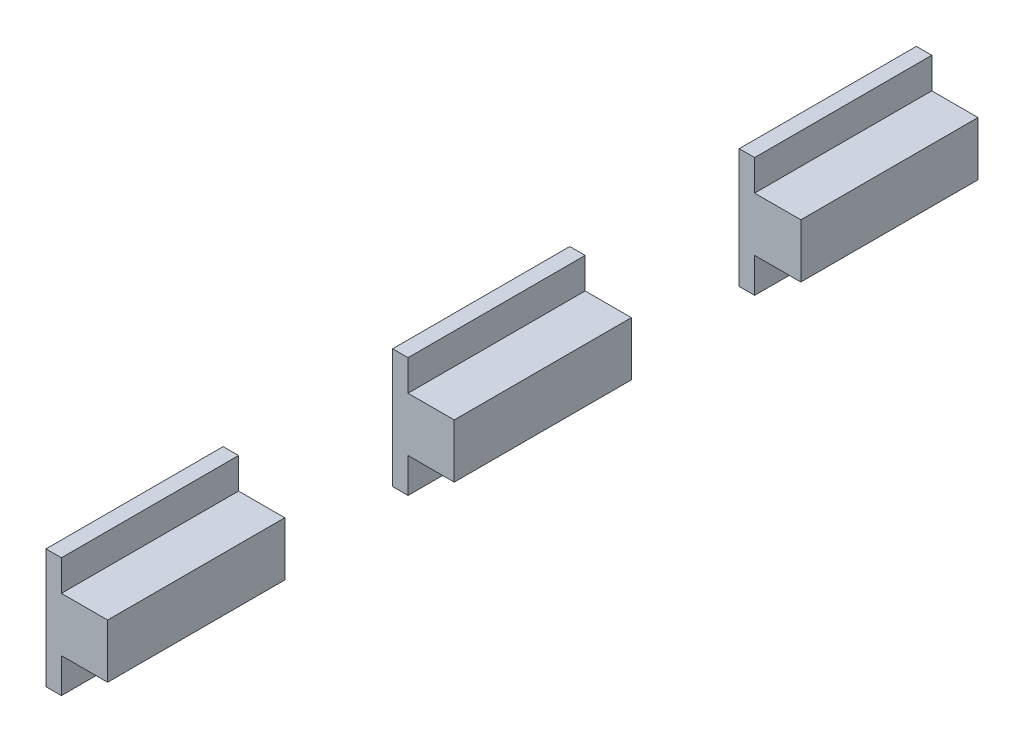
ISO-10303-21;
HEADER;
FILE_DESCRIPTION(('STEP AP214'),'2;1');
FILE_NAME('part.step','',(''),(''),'','','');
FILE_SCHEMA(('AUTOMOTIVE_DESIGN { 1 0 10303 214 1 1 1 1 }'));
ENDSEC;
DATA;
#1=APPLICATION_CONTEXT('core data for automotive mechanical design processes');
#2=APPLICATION_PROTOCOL_DEFINITION('international standard','automotive_design',2000,#1);
#3=PRODUCT_CONTEXT('',#1,'mechanical');
#4=PRODUCT('Part','Part','',(#3));
#5=PRODUCT_RELATED_PRODUCT_CATEGORY('part','',(#4));
#6=PRODUCT_DEFINITION_FORMATION('','',#4);
#7=PRODUCT_DEFINITION_CONTEXT('part definition',#1,'design');
#8=PRODUCT_DEFINITION('design','',#6,#7);
#9=PRODUCT_DEFINITION_SHAPE('','',#8);
#10=(LENGTH_UNIT() NAMED_UNIT(*) SI_UNIT(.MILLI.,.METRE.));
#11=(NAMED_UNIT(*) PLANE_ANGLE_UNIT() SI_UNIT($,.RADIAN.));
#12=(NAMED_UNIT(*) SI_UNIT($,.STERADIAN.) SOLID_ANGLE_UNIT());
#13=UNCERTAINTY_MEASURE_WITH_UNIT(LENGTH_MEASURE(1.E-05),#10,'distance_accuracy_value','');
#14=(GEOMETRIC_REPRESENTATION_CONTEXT(3) GLOBAL_UNCERTAINTY_ASSIGNED_CONTEXT((#13)) GLOBAL_UNIT_ASSIGNED_CONTEXT((#10,
#11,#12)) REPRESENTATION_CONTEXT('',''));
#15=CARTESIAN_POINT('',(0.,0.,0.));
#16=DIRECTION('',(0.,0.,1.));
#17=DIRECTION('',(1.,0.,0.));
#18=AXIS2_PLACEMENT_3D('',#15,#16,#17);
#19=CARTESIAN_POINT('',(87.8,0.,-18.));
#20=DIRECTION('',(1.,0.,0.));
#21=DIRECTION('',(0.,0.,-1.));
#22=AXIS2_PLACEMENT_3D('',#19,#20,#21);
#23=PLANE('',#22);
#24=DIRECTION('',(0.,0.,-1.));
#25=VECTOR('',#24,1.);
#26=CARTESIAN_POINT('',(87.8,12.45,-50.59));
#27=LINE('',#26,#25);
#28=CARTESIAN_POINT('',(87.8,12.45,-50.59));
#29=VERTEX_POINT('',#28);
#30=CARTESIAN_POINT('',(87.8,12.45,-55.19));
#31=VERTEX_POINT('',#30);
#32=EDGE_CURVE('E64',#29,#31,#27,.T.);
#33=ORIENTED_EDGE('',*,*,#32,.F.);
#34=DIRECTION('',(0.,-1.,0.));
#35=VECTOR('',#34,1.);
#36=CARTESIAN_POINT('',(87.8,14.65,-50.59));
#37=LINE('',#36,#35);
#38=CARTESIAN_POINT('',(87.8,11.55,-50.59));
#39=VERTEX_POINT('',#38);
#40=EDGE_CURVE('E159',#29,#39,#37,.T.);
#41=ORIENTED_EDGE('',*,*,#40,.T.);
#42=DIRECTION('',(0.,0.,-1.));
#43=VECTOR('',#42,1.);
#44=CARTESIAN_POINT('',(87.8,11.55,-50.59));
#45=LINE('',#44,#43);
#46=CARTESIAN_POINT('',(87.8,11.55,-55.19));
#47=VERTEX_POINT('',#46);
#48=EDGE_CURVE('E147',#39,#47,#45,.T.);
#49=ORIENTED_EDGE('',*,*,#48,.T.);
#50=DIRECTION('',(0.,1.,0.));
#51=VECTOR('',#50,1.);
#52=CARTESIAN_POINT('',(87.8,11.55,-55.19));
#53=LINE('',#52,#51);
#54=EDGE_CURVE('E137',#47,#31,#53,.T.);
#55=ORIENTED_EDGE('',*,*,#54,.T.);
#56=EDGE_LOOP('',(#33,#41,#49,#55));
#57=FACE_BOUND('',#56,.T.);
#58=ADVANCED_FACE('F47',(#57),#23,.T.);
#59=CARTESIAN_POINT('',(87.4,11.55,-55.19));
#60=DIRECTION('',(0.,0.,-1.));
#61=DIRECTION('',(-1.,0.,0.));
#62=AXIS2_PLACEMENT_3D('',#59,#60,#61);
#63=PLANE('',#62);
#64=ORIENTED_EDGE('',*,*,#54,.F.);
#65=DIRECTION('',(1.,0.,0.));
#66=VECTOR('',#65,1.);
#67=CARTESIAN_POINT('',(87.4,11.55,-55.19));
#68=LINE('',#67,#66);
#69=CARTESIAN_POINT('',(87.4,11.55,-55.19));
#70=VERTEX_POINT('',#69);
#71=EDGE_CURVE('E12',#70,#47,#68,.T.);
#72=ORIENTED_EDGE('',*,*,#71,.F.);
#73=DIRECTION('',(0.,1.,0.));
#74=VECTOR('',#73,1.);
#75=CARTESIAN_POINT('',(87.4,11.55,-55.19));
#76=LINE('',#75,#74);
#77=CARTESIAN_POINT('',(87.4,14.65,-55.19));
#78=VERTEX_POINT('',#77);
#79=EDGE_CURVE('E143',#70,#78,#76,.T.);
#80=ORIENTED_EDGE('',*,*,#79,.T.);
#81=DIRECTION('',(1.,0.,0.));
#82=VECTOR('',#81,1.);
#83=CARTESIAN_POINT('',(87.4,14.65,-55.19));
#84=LINE('',#83,#82);
#85=CARTESIAN_POINT('',(87.8,14.65,-55.19));
#86=VERTEX_POINT('',#85);
#87=EDGE_CURVE('E51',#78,#86,#84,.T.);
#88=ORIENTED_EDGE('',*,*,#87,.T.);
#89=CARTESIAN_POINT('',(87.8,13.85,-55.19));
#90=VERTEX_POINT('',#89);
#91=EDGE_CURVE('E135',#90,#86,#53,.T.);
#92=ORIENTED_EDGE('',*,*,#91,.F.);
#93=DIRECTION('',(-1.,0.,0.));
#94=VECTOR('',#93,1.);
#95=CARTESIAN_POINT('',(89.,13.85,-55.19));
#96=LINE('',#95,#94);
#97=CARTESIAN_POINT('',(89.,13.85,-55.19));
#98=VERTEX_POINT('',#97);
#99=EDGE_CURVE('E117',#98,#90,#96,.T.);
#100=ORIENTED_EDGE('',*,*,#99,.F.);
#101=DIRECTION('',(0.,1.,0.));
#102=VECTOR('',#101,1.);
#103=CARTESIAN_POINT('',(89.,12.45,-55.19));
#104=LINE('',#103,#102);
#105=CARTESIAN_POINT('',(89.,12.45,-55.19));
#106=VERTEX_POINT('',#105);
#107=EDGE_CURVE('E123',#106,#98,#104,.T.);
#108=ORIENTED_EDGE('',*,*,#107,.F.);
#109=DIRECTION('',(-1.,0.,0.));
#110=VECTOR('',#109,1.);
#111=CARTESIAN_POINT('',(89.,12.45,-55.19));
#112=LINE('',#111,#110);
#113=EDGE_CURVE('E179',#106,#31,#112,.T.);
#114=ORIENTED_EDGE('',*,*,#113,.T.);
#115=EDGE_LOOP('',(#64,#72,#80,#88,#92,#100,#108,#114));
#116=FACE_BOUND('',#115,.T.);
#117=ADVANCED_FACE('F49',(#116),#63,.T.);
#118=CARTESIAN_POINT('',(87.4,11.55,-50.59));
#119=DIRECTION('',(0.,-1.,0.));
#120=DIRECTION('',(0.,0.,-1.));
#121=AXIS2_PLACEMENT_3D('',#118,#119,#120);
#122=PLANE('',#121);
#123=ORIENTED_EDGE('',*,*,#48,.F.);
#124=DIRECTION('',(1.,0.,0.));
#125=VECTOR('',#124,1.);
#126=CARTESIAN_POINT('',(87.4,11.55,-50.59));
#127=LINE('',#126,#125);
#128=CARTESIAN_POINT('',(87.4,11.55,-50.59));
#129=VERTEX_POINT('',#128);
#130=EDGE_CURVE('E56',#129,#39,#127,.T.);
#131=ORIENTED_EDGE('',*,*,#130,.F.);
#132=DIRECTION('',(0.,0.,-1.));
#133=VECTOR('',#132,1.);
#134=CARTESIAN_POINT('',(87.4,11.55,-50.59));
#135=LINE('',#134,#133);
#136=EDGE_CURVE('E153',#129,#70,#135,.T.);
#137=ORIENTED_EDGE('',*,*,#136,.T.);
#138=ORIENTED_EDGE('',*,*,#71,.T.);
#139=EDGE_LOOP('',(#123,#131,#137,#138));
#140=FACE_BOUND('',#139,.T.);
#141=ADVANCED_FACE('F187',(#140),#122,.T.);
#142=CARTESIAN_POINT('',(87.4,14.65,-50.59));
#143=DIRECTION('',(0.,0.,1.));
#144=DIRECTION('',(1.,0.,0.));
#145=AXIS2_PLACEMENT_3D('',#142,#143,#144);
#146=PLANE('',#145);
#147=CARTESIAN_POINT('',(87.8,14.65,-50.59));
#148=VERTEX_POINT('',#147);
#149=CARTESIAN_POINT('',(87.8,13.85,-50.59));
#150=VERTEX_POINT('',#149);
#151=EDGE_CURVE('E160',#148,#150,#37,.T.);
#152=ORIENTED_EDGE('',*,*,#151,.F.);
#153=DIRECTION('',(1.,0.,0.));
#154=VECTOR('',#153,1.);
#155=CARTESIAN_POINT('',(87.4,14.65,-50.59));
#156=LINE('',#155,#154);
#157=CARTESIAN_POINT('',(87.4,14.65,-50.59));
#158=VERTEX_POINT('',#157);
#159=EDGE_CURVE('E165',#158,#148,#156,.T.);
#160=ORIENTED_EDGE('',*,*,#159,.F.);
#161=DIRECTION('',(0.,-1.,0.));
#162=VECTOR('',#161,1.);
#163=CARTESIAN_POINT('',(87.4,14.65,-50.59));
#164=LINE('',#163,#162);
#165=EDGE_CURVE('E150',#158,#129,#164,.T.);
#166=ORIENTED_EDGE('',*,*,#165,.T.);
#167=ORIENTED_EDGE('',*,*,#130,.T.);
#168=ORIENTED_EDGE('',*,*,#40,.F.);
#169=DIRECTION('',(-1.,0.,0.));
#170=VECTOR('',#169,1.);
#171=CARTESIAN_POINT('',(89.,12.45,-50.59));
#172=LINE('',#171,#170);
#173=CARTESIAN_POINT('',(89.,12.45,-50.59));
#174=VERTEX_POINT('',#173);
#175=EDGE_CURVE('E139',#174,#29,#172,.T.);
#176=ORIENTED_EDGE('',*,*,#175,.F.);
#177=DIRECTION('',(0.,-1.,0.));
#178=VECTOR('',#177,1.);
#179=CARTESIAN_POINT('',(89.,13.85,-50.59));
#180=LINE('',#179,#178);
#181=CARTESIAN_POINT('',(89.,13.85,-50.59));
#182=VERTEX_POINT('',#181);
#183=EDGE_CURVE('E122',#182,#174,#180,.T.);
#184=ORIENTED_EDGE('',*,*,#183,.F.);
#185=DIRECTION('',(-1.,0.,0.));
#186=VECTOR('',#185,1.);
#187=CARTESIAN_POINT('',(89.,13.85,-50.59));
#188=LINE('',#187,#186);
#189=EDGE_CURVE('E119',#182,#150,#188,.T.);
#190=ORIENTED_EDGE('',*,*,#189,.T.);
#191=EDGE_LOOP('',(#152,#160,#166,#167,#168,#176,#184,#190));
#192=FACE_BOUND('',#191,.T.);
#193=ADVANCED_FACE('F175',(#192),#146,.T.);
#194=CARTESIAN_POINT('',(87.4,14.65,-55.19));
#195=DIRECTION('',(0.,1.,0.));
#196=DIRECTION('',(0.,0.,1.));
#197=AXIS2_PLACEMENT_3D('',#194,#195,#196);
#198=PLANE('',#197);
#199=DIRECTION('',(0.,0.,1.));
#200=VECTOR('',#199,1.);
#201=CARTESIAN_POINT('',(87.8,14.65,-55.19));
#202=LINE('',#201,#200);
#203=EDGE_CURVE('E156',#86,#148,#202,.T.);
#204=ORIENTED_EDGE('',*,*,#203,.F.);
#205=ORIENTED_EDGE('',*,*,#87,.F.);
#206=DIRECTION('',(0.,0.,1.));
#207=VECTOR('',#206,1.);
#208=CARTESIAN_POINT('',(87.4,14.65,-55.19));
#209=LINE('',#208,#207);
#210=EDGE_CURVE('E146',#78,#158,#209,.T.);
#211=ORIENTED_EDGE('',*,*,#210,.T.);
#212=ORIENTED_EDGE('',*,*,#159,.T.);
#213=EDGE_LOOP('',(#204,#205,#211,#212));
#214=FACE_BOUND('',#213,.T.);
#215=ADVANCED_FACE('F171',(#214),#198,.T.);
#216=CARTESIAN_POINT('',(87.4,0.,-18.));
#217=DIRECTION('',(1.,0.,0.));
#218=DIRECTION('',(0.,0.,-1.));
#219=AXIS2_PLACEMENT_3D('',#216,#217,#218);
#220=PLANE('',#219);
#221=ORIENTED_EDGE('',*,*,#79,.F.);
#222=ORIENTED_EDGE('',*,*,#136,.F.);
#223=ORIENTED_EDGE('',*,*,#165,.F.);
#224=ORIENTED_EDGE('',*,*,#210,.F.);
#225=EDGE_LOOP('',(#221,#222,#223,#224));
#226=FACE_BOUND('',#225,.T.);
#227=ADVANCED_FACE('F191',(#226),#220,.F.);
#228=DIRECTION('',(0.,0.,1.));
#229=VECTOR('',#228,1.);
#230=CARTESIAN_POINT('',(87.8,13.85,-55.19));
#231=LINE('',#230,#229);
#232=EDGE_CURVE('E72',#90,#150,#231,.T.);
#233=ORIENTED_EDGE('',*,*,#232,.F.);
#234=ORIENTED_EDGE('',*,*,#91,.T.);
#235=ORIENTED_EDGE('',*,*,#203,.T.);
#236=ORIENTED_EDGE('',*,*,#151,.T.);
#237=EDGE_LOOP('',(#233,#234,#235,#236));
#238=FACE_BOUND('',#237,.T.);
#239=ADVANCED_FACE('F172',(#238),#23,.T.);
#240=CARTESIAN_POINT('',(89.,13.85,-55.19));
#241=DIRECTION('',(0.,-1.,0.));
#242=DIRECTION('',(0.,0.,-1.));
#243=AXIS2_PLACEMENT_3D('',#240,#241,#242);
#244=PLANE('',#243);
#245=ORIENTED_EDGE('',*,*,#232,.T.);
#246=ORIENTED_EDGE('',*,*,#189,.F.);
#247=DIRECTION('',(0.,0.,1.));
#248=VECTOR('',#247,1.);
#249=CARTESIAN_POINT('',(89.,13.85,-55.19));
#250=LINE('',#249,#248);
#251=EDGE_CURVE('E113',#98,#182,#250,.T.);
#252=ORIENTED_EDGE('',*,*,#251,.F.);
#253=ORIENTED_EDGE('',*,*,#99,.T.);
#254=EDGE_LOOP('',(#245,#246,#252,#253));
#255=FACE_BOUND('',#254,.T.);
#256=ADVANCED_FACE('F115',(#255),#244,.F.);
#257=CARTESIAN_POINT('',(89.,12.45,-50.59));
#258=DIRECTION('',(0.,1.,0.));
#259=DIRECTION('',(0.,0.,1.));
#260=AXIS2_PLACEMENT_3D('',#257,#258,#259);
#261=PLANE('',#260);
#262=ORIENTED_EDGE('',*,*,#32,.T.);
#263=ORIENTED_EDGE('',*,*,#113,.F.);
#264=DIRECTION('',(0.,0.,-1.));
#265=VECTOR('',#264,1.);
#266=CARTESIAN_POINT('',(89.,12.45,-50.59));
#267=LINE('',#266,#265);
#268=EDGE_CURVE('E128',#174,#106,#267,.T.);
#269=ORIENTED_EDGE('',*,*,#268,.F.);
#270=ORIENTED_EDGE('',*,*,#175,.T.);
#271=EDGE_LOOP('',(#262,#263,#269,#270));
#272=FACE_BOUND('',#271,.T.);
#273=ADVANCED_FACE('F184',(#272),#261,.F.);
#274=CARTESIAN_POINT('',(89.,0.,-18.));
#275=DIRECTION('',(1.,0.,0.));
#276=DIRECTION('',(0.,0.,-1.));
#277=AXIS2_PLACEMENT_3D('',#274,#275,#276);
#278=PLANE('',#277);
#279=ORIENTED_EDGE('',*,*,#107,.T.);
#280=ORIENTED_EDGE('',*,*,#251,.T.);
#281=ORIENTED_EDGE('',*,*,#183,.T.);
#282=ORIENTED_EDGE('',*,*,#268,.T.);
#283=EDGE_LOOP('',(#279,#280,#281,#282));
#284=FACE_BOUND('',#283,.T.);
#285=ADVANCED_FACE('F126',(#284),#278,.T.);
#286=CLOSED_SHELL('',(#58,#117,#141,#193,#215,#227,#239,#256,#273,#285));
#287=MANIFOLD_SOLID_BREP('B2',#286);
#288=CARTESIAN_POINT('',(87.8,0.,-9.));
#289=DIRECTION('',(1.,0.,0.));
#290=DIRECTION('',(0.,0.,-1.));
#291=AXIS2_PLACEMENT_3D('',#288,#289,#290);
#292=PLANE('',#291);
#293=DIRECTION('',(0.,0.,-1.));
#294=VECTOR('',#293,1.);
#295=CARTESIAN_POINT('',(87.8,12.45,-41.59));
#296=LINE('',#295,#294);
#297=CARTESIAN_POINT('',(87.8,12.45,-41.59));
#298=VERTEX_POINT('',#297);
#299=CARTESIAN_POINT('',(87.8,12.45,-46.19));
#300=VERTEX_POINT('',#299);
#301=EDGE_CURVE('E304',#298,#300,#296,.T.);
#302=ORIENTED_EDGE('',*,*,#301,.F.);
#303=DIRECTION('',(0.,-1.,0.));
#304=VECTOR('',#303,1.);
#305=CARTESIAN_POINT('',(87.8,14.65,-41.59));
#306=LINE('',#305,#304);
#307=CARTESIAN_POINT('',(87.8,11.55,-41.59));
#308=VERTEX_POINT('',#307);
#309=EDGE_CURVE('E399',#298,#308,#306,.T.);
#310=ORIENTED_EDGE('',*,*,#309,.T.);
#311=DIRECTION('',(0.,0.,-1.));
#312=VECTOR('',#311,1.);
#313=CARTESIAN_POINT('',(87.8,11.55,-41.59));
#314=LINE('',#313,#312);
#315=CARTESIAN_POINT('',(87.8,11.55,-46.19));
#316=VERTEX_POINT('',#315);
#317=EDGE_CURVE('E387',#308,#316,#314,.T.);
#318=ORIENTED_EDGE('',*,*,#317,.T.);
#319=DIRECTION('',(0.,1.,0.));
#320=VECTOR('',#319,1.);
#321=CARTESIAN_POINT('',(87.8,11.55,-46.19));
#322=LINE('',#321,#320);
#323=EDGE_CURVE('E377',#316,#300,#322,.T.);
#324=ORIENTED_EDGE('',*,*,#323,.T.);
#325=EDGE_LOOP('',(#302,#310,#318,#324));
#326=FACE_BOUND('',#325,.T.);
#327=ADVANCED_FACE('F287',(#326),#292,.T.);
#328=CARTESIAN_POINT('',(87.4,11.55,-46.19));
#329=DIRECTION('',(0.,0.,-1.));
#330=DIRECTION('',(-1.,0.,0.));
#331=AXIS2_PLACEMENT_3D('',#328,#329,#330);
#332=PLANE('',#331);
#333=ORIENTED_EDGE('',*,*,#323,.F.);
#334=DIRECTION('',(1.,0.,0.));
#335=VECTOR('',#334,1.);
#336=CARTESIAN_POINT('',(87.4,11.55,-46.19));
#337=LINE('',#336,#335);
#338=CARTESIAN_POINT('',(87.4,11.55,-46.19));
#339=VERTEX_POINT('',#338);
#340=EDGE_CURVE('E45',#339,#316,#337,.T.);
#341=ORIENTED_EDGE('',*,*,#340,.F.);
#342=DIRECTION('',(0.,1.,0.));
#343=VECTOR('',#342,1.);
#344=CARTESIAN_POINT('',(87.4,11.55,-46.19));
#345=LINE('',#344,#343);
#346=CARTESIAN_POINT('',(87.4,14.65,-46.19));
#347=VERTEX_POINT('',#346);
#348=EDGE_CURVE('E383',#339,#347,#345,.T.);
#349=ORIENTED_EDGE('',*,*,#348,.T.);
#350=DIRECTION('',(1.,0.,0.));
#351=VECTOR('',#350,1.);
#352=CARTESIAN_POINT('',(87.4,14.65,-46.19));
#353=LINE('',#352,#351);
#354=CARTESIAN_POINT('',(87.8,14.65,-46.19));
#355=VERTEX_POINT('',#354);
#356=EDGE_CURVE('E291',#347,#355,#353,.T.);
#357=ORIENTED_EDGE('',*,*,#356,.T.);
#358=CARTESIAN_POINT('',(87.8,13.85,-46.19));
#359=VERTEX_POINT('',#358);
#360=EDGE_CURVE('E375',#359,#355,#322,.T.);
#361=ORIENTED_EDGE('',*,*,#360,.F.);
#362=DIRECTION('',(-1.,0.,0.));
#363=VECTOR('',#362,1.);
#364=CARTESIAN_POINT('',(89.,13.85,-46.19));
#365=LINE('',#364,#363);
#366=CARTESIAN_POINT('',(89.,13.85,-46.19));
#367=VERTEX_POINT('',#366);
#368=EDGE_CURVE('E357',#367,#359,#365,.T.);
#369=ORIENTED_EDGE('',*,*,#368,.F.);
#370=DIRECTION('',(0.,1.,0.));
#371=VECTOR('',#370,1.);
#372=CARTESIAN_POINT('',(89.,12.45,-46.19));
#373=LINE('',#372,#371);
#374=CARTESIAN_POINT('',(89.,12.45,-46.19));
#375=VERTEX_POINT('',#374);
#376=EDGE_CURVE('E363',#375,#367,#373,.T.);
#377=ORIENTED_EDGE('',*,*,#376,.F.);
#378=DIRECTION('',(-1.,0.,0.));
#379=VECTOR('',#378,1.);
#380=CARTESIAN_POINT('',(89.,12.45,-46.19));
#381=LINE('',#380,#379);
#382=EDGE_CURVE('E419',#375,#300,#381,.T.);
#383=ORIENTED_EDGE('',*,*,#382,.T.);
#384=EDGE_LOOP('',(#333,#341,#349,#357,#361,#369,#377,#383));
#385=FACE_BOUND('',#384,.T.);
#386=ADVANCED_FACE('F289',(#385),#332,.T.);
#387=CARTESIAN_POINT('',(87.4,11.55,-41.59));
#388=DIRECTION('',(0.,-1.,0.));
#389=DIRECTION('',(0.,0.,-1.));
#390=AXIS2_PLACEMENT_3D('',#387,#388,#389);
#391=PLANE('',#390);
#392=ORIENTED_EDGE('',*,*,#317,.F.);
#393=DIRECTION('',(1.,0.,0.));
#394=VECTOR('',#393,1.);
#395=CARTESIAN_POINT('',(87.4,11.55,-41.59));
#396=LINE('',#395,#394);
#397=CARTESIAN_POINT('',(87.4,11.55,-41.59));
#398=VERTEX_POINT('',#397);
#399=EDGE_CURVE('E296',#398,#308,#396,.T.);
#400=ORIENTED_EDGE('',*,*,#399,.F.);
#401=DIRECTION('',(0.,0.,-1.));
#402=VECTOR('',#401,1.);
#403=CARTESIAN_POINT('',(87.4,11.55,-41.59));
#404=LINE('',#403,#402);
#405=EDGE_CURVE('E393',#398,#339,#404,.T.);
#406=ORIENTED_EDGE('',*,*,#405,.T.);
#407=ORIENTED_EDGE('',*,*,#340,.T.);
#408=EDGE_LOOP('',(#392,#400,#406,#407));
#409=FACE_BOUND('',#408,.T.);
#410=ADVANCED_FACE('F427',(#409),#391,.T.);
#411=CARTESIAN_POINT('',(87.4,14.65,-41.59));
#412=DIRECTION('',(0.,0.,1.));
#413=DIRECTION('',(1.,0.,0.));
#414=AXIS2_PLACEMENT_3D('',#411,#412,#413);
#415=PLANE('',#414);
#416=CARTESIAN_POINT('',(87.8,14.65,-41.59));
#417=VERTEX_POINT('',#416);
#418=CARTESIAN_POINT('',(87.8,13.85,-41.59));
#419=VERTEX_POINT('',#418);
#420=EDGE_CURVE('E400',#417,#419,#306,.T.);
#421=ORIENTED_EDGE('',*,*,#420,.F.);
#422=DIRECTION('',(1.,0.,0.));
#423=VECTOR('',#422,1.);
#424=CARTESIAN_POINT('',(87.4,14.65,-41.59));
#425=LINE('',#424,#423);
#426=CARTESIAN_POINT('',(87.4,14.65,-41.59));
#427=VERTEX_POINT('',#426);
#428=EDGE_CURVE('E405',#427,#417,#425,.T.);
#429=ORIENTED_EDGE('',*,*,#428,.F.);
#430=DIRECTION('',(0.,-1.,0.));
#431=VECTOR('',#430,1.);
#432=CARTESIAN_POINT('',(87.4,14.65,-41.59));
#433=LINE('',#432,#431);
#434=EDGE_CURVE('E390',#427,#398,#433,.T.);
#435=ORIENTED_EDGE('',*,*,#434,.T.);
#436=ORIENTED_EDGE('',*,*,#399,.T.);
#437=ORIENTED_EDGE('',*,*,#309,.F.);
#438=DIRECTION('',(-1.,0.,0.));
#439=VECTOR('',#438,1.);
#440=CARTESIAN_POINT('',(89.,12.45,-41.59));
#441=LINE('',#440,#439);
#442=CARTESIAN_POINT('',(89.,12.45,-41.59));
#443=VERTEX_POINT('',#442);
#444=EDGE_CURVE('E379',#443,#298,#441,.T.);
#445=ORIENTED_EDGE('',*,*,#444,.F.);
#446=DIRECTION('',(0.,-1.,0.));
#447=VECTOR('',#446,1.);
#448=CARTESIAN_POINT('',(89.,13.85,-41.59));
#449=LINE('',#448,#447);
#450=CARTESIAN_POINT('',(89.,13.85,-41.59));
#451=VERTEX_POINT('',#450);
#452=EDGE_CURVE('E362',#451,#443,#449,.T.);
#453=ORIENTED_EDGE('',*,*,#452,.F.);
#454=DIRECTION('',(-1.,0.,0.));
#455=VECTOR('',#454,1.);
#456=CARTESIAN_POINT('',(89.,13.85,-41.59));
#457=LINE('',#456,#455);
#458=EDGE_CURVE('E359',#451,#419,#457,.T.);
#459=ORIENTED_EDGE('',*,*,#458,.T.);
#460=EDGE_LOOP('',(#421,#429,#435,#436,#437,#445,#453,#459));
#461=FACE_BOUND('',#460,.T.);
#462=ADVANCED_FACE('F415',(#461),#415,.T.);
#463=CARTESIAN_POINT('',(87.4,14.65,-46.19));
#464=DIRECTION('',(0.,1.,0.));
#465=DIRECTION('',(0.,0.,1.));
#466=AXIS2_PLACEMENT_3D('',#463,#464,#465);
#467=PLANE('',#466);
#468=DIRECTION('',(0.,0.,1.));
#469=VECTOR('',#468,1.);
#470=CARTESIAN_POINT('',(87.8,14.65,-46.19));
#471=LINE('',#470,#469);
#472=EDGE_CURVE('E396',#355,#417,#471,.T.);
#473=ORIENTED_EDGE('',*,*,#472,.F.);
#474=ORIENTED_EDGE('',*,*,#356,.F.);
#475=DIRECTION('',(0.,0.,1.));
#476=VECTOR('',#475,1.);
#477=CARTESIAN_POINT('',(87.4,14.65,-46.19));
#478=LINE('',#477,#476);
#479=EDGE_CURVE('E386',#347,#427,#478,.T.);
#480=ORIENTED_EDGE('',*,*,#479,.T.);
#481=ORIENTED_EDGE('',*,*,#428,.T.);
#482=EDGE_LOOP('',(#473,#474,#480,#481));
#483=FACE_BOUND('',#482,.T.);
#484=ADVANCED_FACE('F411',(#483),#467,.T.);
#485=CARTESIAN_POINT('',(87.4,0.,-9.));
#486=DIRECTION('',(1.,0.,0.));
#487=DIRECTION('',(0.,0.,-1.));
#488=AXIS2_PLACEMENT_3D('',#485,#486,#487);
#489=PLANE('',#488);
#490=ORIENTED_EDGE('',*,*,#348,.F.);
#491=ORIENTED_EDGE('',*,*,#405,.F.);
#492=ORIENTED_EDGE('',*,*,#434,.F.);
#493=ORIENTED_EDGE('',*,*,#479,.F.);
#494=EDGE_LOOP('',(#490,#491,#492,#493));
#495=FACE_BOUND('',#494,.T.);
#496=ADVANCED_FACE('F431',(#495),#489,.F.);
#497=DIRECTION('',(0.,0.,1.));
#498=VECTOR('',#497,1.);
#499=CARTESIAN_POINT('',(87.8,13.85,-46.19));
#500=LINE('',#499,#498);
#501=EDGE_CURVE('E312',#359,#419,#500,.T.);
#502=ORIENTED_EDGE('',*,*,#501,.F.);
#503=ORIENTED_EDGE('',*,*,#360,.T.);
#504=ORIENTED_EDGE('',*,*,#472,.T.);
#505=ORIENTED_EDGE('',*,*,#420,.T.);
#506=EDGE_LOOP('',(#502,#503,#504,#505));
#507=FACE_BOUND('',#506,.T.);
#508=ADVANCED_FACE('F412',(#507),#292,.T.);
#509=CARTESIAN_POINT('',(89.,13.85,-46.19));
#510=DIRECTION('',(0.,-1.,0.));
#511=DIRECTION('',(0.,0.,-1.));
#512=AXIS2_PLACEMENT_3D('',#509,#510,#511);
#513=PLANE('',#512);
#514=ORIENTED_EDGE('',*,*,#501,.T.);
#515=ORIENTED_EDGE('',*,*,#458,.F.);
#516=DIRECTION('',(0.,0.,1.));
#517=VECTOR('',#516,1.);
#518=CARTESIAN_POINT('',(89.,13.85,-46.19));
#519=LINE('',#518,#517);
#520=EDGE_CURVE('E353',#367,#451,#519,.T.);
#521=ORIENTED_EDGE('',*,*,#520,.F.);
#522=ORIENTED_EDGE('',*,*,#368,.T.);
#523=EDGE_LOOP('',(#514,#515,#521,#522));
#524=FACE_BOUND('',#523,.T.);
#525=ADVANCED_FACE('F355',(#524),#513,.F.);
#526=CARTESIAN_POINT('',(89.,12.45,-41.59));
#527=DIRECTION('',(0.,1.,0.));
#528=DIRECTION('',(0.,0.,1.));
#529=AXIS2_PLACEMENT_3D('',#526,#527,#528);
#530=PLANE('',#529);
#531=ORIENTED_EDGE('',*,*,#301,.T.);
#532=ORIENTED_EDGE('',*,*,#382,.F.);
#533=DIRECTION('',(0.,0.,-1.));
#534=VECTOR('',#533,1.);
#535=CARTESIAN_POINT('',(89.,12.45,-41.59));
#536=LINE('',#535,#534);
#537=EDGE_CURVE('E368',#443,#375,#536,.T.);
#538=ORIENTED_EDGE('',*,*,#537,.F.);
#539=ORIENTED_EDGE('',*,*,#444,.T.);
#540=EDGE_LOOP('',(#531,#532,#538,#539));
#541=FACE_BOUND('',#540,.T.);
#542=ADVANCED_FACE('F424',(#541),#530,.F.);
#543=CARTESIAN_POINT('',(89.,0.,-9.));
#544=DIRECTION('',(1.,0.,0.));
#545=DIRECTION('',(0.,0.,-1.));
#546=AXIS2_PLACEMENT_3D('',#543,#544,#545);
#547=PLANE('',#546);
#548=ORIENTED_EDGE('',*,*,#376,.T.);
#549=ORIENTED_EDGE('',*,*,#520,.T.);
#550=ORIENTED_EDGE('',*,*,#452,.T.);
#551=ORIENTED_EDGE('',*,*,#537,.T.);
#552=EDGE_LOOP('',(#548,#549,#550,#551));
#553=FACE_BOUND('',#552,.T.);
#554=ADVANCED_FACE('F366',(#553),#547,.T.);
#555=CLOSED_SHELL('',(#327,#386,#410,#462,#484,#496,#508,#525,#542,#554));
#556=MANIFOLD_SOLID_BREP('B6',#555);
#557=CARTESIAN_POINT('',(87.8,0.,0.));
#558=DIRECTION('',(1.,0.,0.));
#559=DIRECTION('',(0.,0.,-1.));
#560=AXIS2_PLACEMENT_3D('',#557,#558,#559);
#561=PLANE('',#560);
#562=DIRECTION('',(0.,0.,-1.));
#563=VECTOR('',#562,1.);
#564=CARTESIAN_POINT('',(87.8,12.45,-32.59));
#565=LINE('',#564,#563);
#566=CARTESIAN_POINT('',(87.8,12.45,-32.59));
#567=VERTEX_POINT('',#566);
#568=CARTESIAN_POINT('',(87.8,12.45,-37.19));
#569=VERTEX_POINT('',#568);
#570=EDGE_CURVE('E543',#567,#569,#565,.T.);
#571=ORIENTED_EDGE('',*,*,#570,.F.);
#572=DIRECTION('',(0.,-1.,0.));
#573=VECTOR('',#572,1.);
#574=CARTESIAN_POINT('',(87.8,14.65,-32.59));
#575=LINE('',#574,#573);
#576=CARTESIAN_POINT('',(87.8,11.55,-32.59));
#577=VERTEX_POINT('',#576);
#578=EDGE_CURVE('E638',#567,#577,#575,.T.);
#579=ORIENTED_EDGE('',*,*,#578,.T.);
#580=DIRECTION('',(0.,0.,-1.));
#581=VECTOR('',#580,1.);
#582=CARTESIAN_POINT('',(87.8,11.55,-32.59));
#583=LINE('',#582,#581);
#584=CARTESIAN_POINT('',(87.8,11.55,-37.19));
#585=VERTEX_POINT('',#584);
#586=EDGE_CURVE('E626',#577,#585,#583,.T.);
#587=ORIENTED_EDGE('',*,*,#586,.T.);
#588=DIRECTION('',(0.,1.,0.));
#589=VECTOR('',#588,1.);
#590=CARTESIAN_POINT('',(87.8,11.55,-37.19));
#591=LINE('',#590,#589);
#592=EDGE_CURVE('E616',#585,#569,#591,.T.);
#593=ORIENTED_EDGE('',*,*,#592,.T.);
#594=EDGE_LOOP('',(#571,#579,#587,#593));
#595=FACE_BOUND('',#594,.T.);
#596=ADVANCED_FACE('F526',(#595),#561,.T.);
#597=CARTESIAN_POINT('',(87.4,11.55,-37.19));
#598=DIRECTION('',(0.,0.,-1.));
#599=DIRECTION('',(-1.,0.,0.));
#600=AXIS2_PLACEMENT_3D('',#597,#598,#599);
#601=PLANE('',#600);
#602=ORIENTED_EDGE('',*,*,#592,.F.);
#603=DIRECTION('',(1.,0.,0.));
#604=VECTOR('',#603,1.);
#605=CARTESIAN_POINT('',(87.4,11.55,-37.19));
#606=LINE('',#605,#604);
#607=CARTESIAN_POINT('',(87.4,11.55,-37.19));
#608=VERTEX_POINT('',#607);
#609=EDGE_CURVE('E285',#608,#585,#606,.T.);
#610=ORIENTED_EDGE('',*,*,#609,.F.);
#611=DIRECTION('',(0.,1.,0.));
#612=VECTOR('',#611,1.);
#613=CARTESIAN_POINT('',(87.4,11.55,-37.19));
#614=LINE('',#613,#612);
#615=CARTESIAN_POINT('',(87.4,14.65,-37.19));
#616=VERTEX_POINT('',#615);
#617=EDGE_CURVE('E622',#608,#616,#614,.T.);
#618=ORIENTED_EDGE('',*,*,#617,.T.);
#619=DIRECTION('',(1.,0.,0.));
#620=VECTOR('',#619,1.);
#621=CARTESIAN_POINT('',(87.4,14.65,-37.19));
#622=LINE('',#621,#620);
#623=CARTESIAN_POINT('',(87.8,14.65,-37.19));
#624=VERTEX_POINT('',#623);
#625=EDGE_CURVE('E530',#616,#624,#622,.T.);
#626=ORIENTED_EDGE('',*,*,#625,.T.);
#627=CARTESIAN_POINT('',(87.8,13.85,-37.19));
#628=VERTEX_POINT('',#627);
#629=EDGE_CURVE('E614',#628,#624,#591,.T.);
#630=ORIENTED_EDGE('',*,*,#629,.F.);
#631=DIRECTION('',(-1.,0.,0.));
#632=VECTOR('',#631,1.);
#633=CARTESIAN_POINT('',(89.,13.85,-37.19));
#634=LINE('',#633,#632);
#635=CARTESIAN_POINT('',(89.,13.85,-37.19));
#636=VERTEX_POINT('',#635);
#637=EDGE_CURVE('E596',#636,#628,#634,.T.);
#638=ORIENTED_EDGE('',*,*,#637,.F.);
#639=DIRECTION('',(0.,1.,0.));
#640=VECTOR('',#639,1.);
#641=CARTESIAN_POINT('',(89.,12.45,-37.19));
#642=LINE('',#641,#640);
#643=CARTESIAN_POINT('',(89.,12.45,-37.19));
#644=VERTEX_POINT('',#643);
#645=EDGE_CURVE('E602',#644,#636,#642,.T.);
#646=ORIENTED_EDGE('',*,*,#645,.F.);
#647=DIRECTION('',(-1.,0.,0.));
#648=VECTOR('',#647,1.);
#649=CARTESIAN_POINT('',(89.,12.45,-37.19));
#650=LINE('',#649,#648);
#651=EDGE_CURVE('E658',#644,#569,#650,.T.);
#652=ORIENTED_EDGE('',*,*,#651,.T.);
#653=EDGE_LOOP('',(#602,#610,#618,#626,#630,#638,#646,#652));
#654=FACE_BOUND('',#653,.T.);
#655=ADVANCED_FACE('F528',(#654),#601,.T.);
#656=CARTESIAN_POINT('',(87.4,11.55,-32.59));
#657=DIRECTION('',(0.,-1.,0.));
#658=DIRECTION('',(0.,0.,-1.));
#659=AXIS2_PLACEMENT_3D('',#656,#657,#658);
#660=PLANE('',#659);
#661=ORIENTED_EDGE('',*,*,#586,.F.);
#662=DIRECTION('',(1.,0.,0.));
#663=VECTOR('',#662,1.);
#664=CARTESIAN_POINT('',(87.4,11.55,-32.59));
#665=LINE('',#664,#663);
#666=CARTESIAN_POINT('',(87.4,11.55,-32.59));
#667=VERTEX_POINT('',#666);
#668=EDGE_CURVE('E535',#667,#577,#665,.T.);
#669=ORIENTED_EDGE('',*,*,#668,.F.);
#670=DIRECTION('',(0.,0.,-1.));
#671=VECTOR('',#670,1.);
#672=CARTESIAN_POINT('',(87.4,11.55,-32.59));
#673=LINE('',#672,#671);
#674=EDGE_CURVE('E632',#667,#608,#673,.T.);
#675=ORIENTED_EDGE('',*,*,#674,.T.);
#676=ORIENTED_EDGE('',*,*,#609,.T.);
#677=EDGE_LOOP('',(#661,#669,#675,#676));
#678=FACE_BOUND('',#677,.T.);
#679=ADVANCED_FACE('F666',(#678),#660,.T.);
#680=CARTESIAN_POINT('',(87.4,14.65,-32.59));
#681=DIRECTION('',(0.,0.,1.));
#682=DIRECTION('',(1.,0.,0.));
#683=AXIS2_PLACEMENT_3D('',#680,#681,#682);
#684=PLANE('',#683);
#685=CARTESIAN_POINT('',(87.8,14.65,-32.59));
#686=VERTEX_POINT('',#685);
#687=CARTESIAN_POINT('',(87.8,13.85,-32.59));
#688=VERTEX_POINT('',#687);
#689=EDGE_CURVE('E639',#686,#688,#575,.T.);
#690=ORIENTED_EDGE('',*,*,#689,.F.);
#691=DIRECTION('',(1.,0.,0.));
#692=VECTOR('',#691,1.);
#693=CARTESIAN_POINT('',(87.4,14.65,-32.59));
#694=LINE('',#693,#692);
#695=CARTESIAN_POINT('',(87.4,14.65,-32.59));
#696=VERTEX_POINT('',#695);
#697=EDGE_CURVE('E644',#696,#686,#694,.T.);
#698=ORIENTED_EDGE('',*,*,#697,.F.);
#699=DIRECTION('',(0.,-1.,0.));
#700=VECTOR('',#699,1.);
#701=CARTESIAN_POINT('',(87.4,14.65,-32.59));
#702=LINE('',#701,#700);
#703=EDGE_CURVE('E629',#696,#667,#702,.T.);
#704=ORIENTED_EDGE('',*,*,#703,.T.);
#705=ORIENTED_EDGE('',*,*,#668,.T.);
#706=ORIENTED_EDGE('',*,*,#578,.F.);
#707=DIRECTION('',(-1.,0.,0.));
#708=VECTOR('',#707,1.);
#709=CARTESIAN_POINT('',(89.,12.45,-32.59));
#710=LINE('',#709,#708);
#711=CARTESIAN_POINT('',(89.,12.45,-32.59));
#712=VERTEX_POINT('',#711);
#713=EDGE_CURVE('E618',#712,#567,#710,.T.);
#714=ORIENTED_EDGE('',*,*,#713,.F.);
#715=DIRECTION('',(0.,-1.,0.));
#716=VECTOR('',#715,1.);
#717=CARTESIAN_POINT('',(89.,13.85,-32.59));
#718=LINE('',#717,#716);
#719=CARTESIAN_POINT('',(89.,13.85,-32.59));
#720=VERTEX_POINT('',#719);
#721=EDGE_CURVE('E601',#720,#712,#718,.T.);
#722=ORIENTED_EDGE('',*,*,#721,.F.);
#723=DIRECTION('',(-1.,0.,0.));
#724=VECTOR('',#723,1.);
#725=CARTESIAN_POINT('',(89.,13.85,-32.59));
#726=LINE('',#725,#724);
#727=EDGE_CURVE('E598',#720,#688,#726,.T.);
#728=ORIENTED_EDGE('',*,*,#727,.T.);
#729=EDGE_LOOP('',(#690,#698,#704,#705,#706,#714,#722,#728));
#730=FACE_BOUND('',#729,.T.);
#731=ADVANCED_FACE('F654',(#730),#684,.T.);
#732=CARTESIAN_POINT('',(87.4,14.65,-37.19));
#733=DIRECTION('',(0.,1.,0.));
#734=DIRECTION('',(0.,0.,1.));
#735=AXIS2_PLACEMENT_3D('',#732,#733,#734);
#736=PLANE('',#735);
#737=DIRECTION('',(0.,0.,1.));
#738=VECTOR('',#737,1.);
#739=CARTESIAN_POINT('',(87.8,14.65,-37.19));
#740=LINE('',#739,#738);
#741=EDGE_CURVE('E635',#624,#686,#740,.T.);
#742=ORIENTED_EDGE('',*,*,#741,.F.);
#743=ORIENTED_EDGE('',*,*,#625,.F.);
#744=DIRECTION('',(0.,0.,1.));
#745=VECTOR('',#744,1.);
#746=CARTESIAN_POINT('',(87.4,14.65,-37.19));
#747=LINE('',#746,#745);
#748=EDGE_CURVE('E625',#616,#696,#747,.T.);
#749=ORIENTED_EDGE('',*,*,#748,.T.);
#750=ORIENTED_EDGE('',*,*,#697,.T.);
#751=EDGE_LOOP('',(#742,#743,#749,#750));
#752=FACE_BOUND('',#751,.T.);
#753=ADVANCED_FACE('F650',(#752),#736,.T.);
#754=CARTESIAN_POINT('',(87.4,0.,0.));
#755=DIRECTION('',(1.,0.,0.));
#756=DIRECTION('',(0.,0.,-1.));
#757=AXIS2_PLACEMENT_3D('',#754,#755,#756);
#758=PLANE('',#757);
#759=ORIENTED_EDGE('',*,*,#617,.F.);
#760=ORIENTED_EDGE('',*,*,#674,.F.);
#761=ORIENTED_EDGE('',*,*,#703,.F.);
#762=ORIENTED_EDGE('',*,*,#748,.F.);
#763=EDGE_LOOP('',(#759,#760,#761,#762));
#764=FACE_BOUND('',#763,.T.);
#765=ADVANCED_FACE('F670',(#764),#758,.F.);
#766=DIRECTION('',(0.,0.,1.));
#767=VECTOR('',#766,1.);
#768=CARTESIAN_POINT('',(87.8,13.85,-37.19));
#769=LINE('',#768,#767);
#770=EDGE_CURVE('E551',#628,#688,#769,.T.);
#771=ORIENTED_EDGE('',*,*,#770,.F.);
#772=ORIENTED_EDGE('',*,*,#629,.T.);
#773=ORIENTED_EDGE('',*,*,#741,.T.);
#774=ORIENTED_EDGE('',*,*,#689,.T.);
#775=EDGE_LOOP('',(#771,#772,#773,#774));
#776=FACE_BOUND('',#775,.T.);
#777=ADVANCED_FACE('F651',(#776),#561,.T.);
#778=CARTESIAN_POINT('',(89.,13.85,-37.19));
#779=DIRECTION('',(0.,-1.,0.));
#780=DIRECTION('',(0.,0.,-1.));
#781=AXIS2_PLACEMENT_3D('',#778,#779,#780);
#782=PLANE('',#781);
#783=ORIENTED_EDGE('',*,*,#770,.T.);
#784=ORIENTED_EDGE('',*,*,#727,.F.);
#785=DIRECTION('',(0.,0.,1.));
#786=VECTOR('',#785,1.);
#787=CARTESIAN_POINT('',(89.,13.85,-37.19));
#788=LINE('',#787,#786);
#789=EDGE_CURVE('E592',#636,#720,#788,.T.);
#790=ORIENTED_EDGE('',*,*,#789,.F.);
#791=ORIENTED_EDGE('',*,*,#637,.T.);
#792=EDGE_LOOP('',(#783,#784,#790,#791));
#793=FACE_BOUND('',#792,.T.);
#794=ADVANCED_FACE('F594',(#793),#782,.F.);
#795=CARTESIAN_POINT('',(89.,12.45,-32.59));
#796=DIRECTION('',(0.,1.,0.));
#797=DIRECTION('',(0.,0.,1.));
#798=AXIS2_PLACEMENT_3D('',#795,#796,#797);
#799=PLANE('',#798);
#800=ORIENTED_EDGE('',*,*,#570,.T.);
#801=ORIENTED_EDGE('',*,*,#651,.F.);
#802=DIRECTION('',(0.,0.,-1.));
#803=VECTOR('',#802,1.);
#804=CARTESIAN_POINT('',(89.,12.45,-32.59));
#805=LINE('',#804,#803);
#806=EDGE_CURVE('E607',#712,#644,#805,.T.);
#807=ORIENTED_EDGE('',*,*,#806,.F.);
#808=ORIENTED_EDGE('',*,*,#713,.T.);
#809=EDGE_LOOP('',(#800,#801,#807,#808));
#810=FACE_BOUND('',#809,.T.);
#811=ADVANCED_FACE('F663',(#810),#799,.F.);
#812=CARTESIAN_POINT('',(89.,0.,0.));
#813=DIRECTION('',(1.,0.,0.));
#814=DIRECTION('',(0.,0.,-1.));
#815=AXIS2_PLACEMENT_3D('',#812,#813,#814);
#816=PLANE('',#815);
#817=ORIENTED_EDGE('',*,*,#645,.T.);
#818=ORIENTED_EDGE('',*,*,#789,.T.);
#819=ORIENTED_EDGE('',*,*,#721,.T.);
#820=ORIENTED_EDGE('',*,*,#806,.T.);
#821=EDGE_LOOP('',(#817,#818,#819,#820));
#822=FACE_BOUND('',#821,.T.);
#823=ADVANCED_FACE('F605',(#822),#816,.T.);
#824=CLOSED_SHELL('',(#596,#655,#679,#731,#753,#765,#777,#794,#811,#823));
#825=MANIFOLD_SOLID_BREP('B39',#824);
#826=ADVANCED_BREP_SHAPE_REPRESENTATION('',(#18,#287,#556,#825),#14);
#827=SHAPE_DEFINITION_REPRESENTATION(#9,#826);
ENDSEC;
END-ISO-10303-21;
